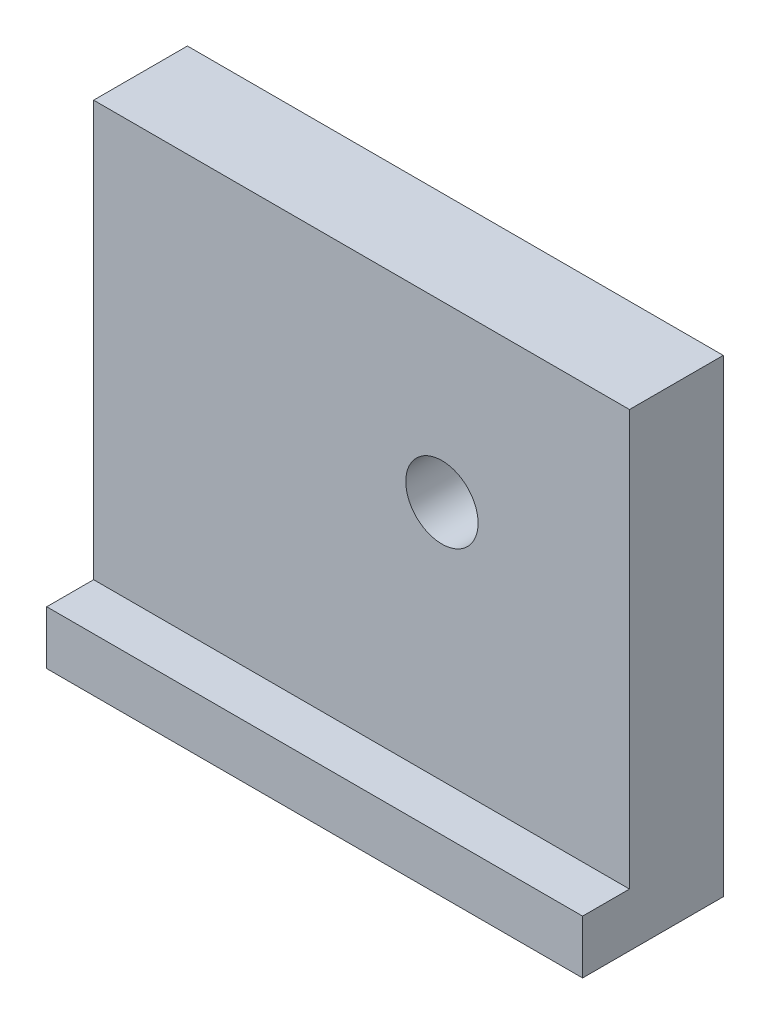
ISO-10303-21;
HEADER;
FILE_DESCRIPTION(('STEP AP214'),'2;1');
FILE_NAME('part.step','',(''),(''),'','','');
FILE_SCHEMA(('AUTOMOTIVE_DESIGN { 1 0 10303 214 1 1 1 1 }'));
ENDSEC;
DATA;
#1=APPLICATION_CONTEXT('core data for automotive mechanical design processes');
#2=APPLICATION_PROTOCOL_DEFINITION('international standard','automotive_design',2000,#1);
#3=PRODUCT_CONTEXT('',#1,'mechanical');
#4=PRODUCT('Part','Part','',(#3));
#5=PRODUCT_RELATED_PRODUCT_CATEGORY('part','',(#4));
#6=PRODUCT_DEFINITION_FORMATION('','',#4);
#7=PRODUCT_DEFINITION_CONTEXT('part definition',#1,'design');
#8=PRODUCT_DEFINITION('design','',#6,#7);
#9=PRODUCT_DEFINITION_SHAPE('','',#8);
#10=(LENGTH_UNIT() NAMED_UNIT(*) SI_UNIT(.MILLI.,.METRE.));
#11=(NAMED_UNIT(*) PLANE_ANGLE_UNIT() SI_UNIT($,.RADIAN.));
#12=(NAMED_UNIT(*) SI_UNIT($,.STERADIAN.) SOLID_ANGLE_UNIT());
#13=UNCERTAINTY_MEASURE_WITH_UNIT(LENGTH_MEASURE(1.E-05),#10,'distance_accuracy_value','');
#14=(GEOMETRIC_REPRESENTATION_CONTEXT(3) GLOBAL_UNCERTAINTY_ASSIGNED_CONTEXT((#13)) GLOBAL_UNIT_ASSIGNED_CONTEXT((#10,
#11,#12)) REPRESENTATION_CONTEXT('',''));
#15=CARTESIAN_POINT('',(0.,0.,0.));
#16=DIRECTION('',(0.,0.,1.));
#17=DIRECTION('',(1.,0.,0.));
#18=AXIS2_PLACEMENT_3D('',#15,#16,#17);
#19=CARTESIAN_POINT('',(0.,0.,3.5));
#20=DIRECTION('',(0.,0.,1.));
#21=DIRECTION('',(1.,0.,0.));
#22=AXIS2_PLACEMENT_3D('',#19,#20,#21);
#23=PLANE('',#22);
#24=CARTESIAN_POINT('',(6.,22.,3.5));
#25=DIRECTION('',(0.,0.,1.));
#26=DIRECTION('',(1.,0.,0.));
#27=AXIS2_PLACEMENT_3D('',#24,#25,#26);
#28=CIRCLE('',#27,2.7);
#29=CARTESIAN_POINT('',(8.7,22.,3.5));
#30=VERTEX_POINT('',#29);
#31=EDGE_CURVE('E111',#30,#30,#28,.T.);
#32=ORIENTED_EDGE('',*,*,#31,.F.);
#33=EDGE_LOOP('',(#32));
#34=FACE_BOUND('',#33,.T.);
#35=DIRECTION('',(0.,-1.,0.));
#36=VECTOR('',#35,1.);
#37=CARTESIAN_POINT('',(-20.,35.,3.5));
#38=LINE('',#37,#36);
#39=CARTESIAN_POINT('',(-20.,35.,3.5));
#40=VERTEX_POINT('',#39);
#41=CARTESIAN_POINT('',(-20.,4.,3.5));
#42=VERTEX_POINT('',#41);
#43=EDGE_CURVE('E96',#40,#42,#38,.T.);
#44=ORIENTED_EDGE('',*,*,#43,.T.);
#45=DIRECTION('',(1.,0.,0.));
#46=VECTOR('',#45,1.);
#47=CARTESIAN_POINT('',(0.,4.,3.5));
#48=LINE('',#47,#46);
#49=CARTESIAN_POINT('',(20.,4.,3.5));
#50=VERTEX_POINT('',#49);
#51=EDGE_CURVE('E132',#42,#50,#48,.T.);
#52=ORIENTED_EDGE('',*,*,#51,.T.);
#53=DIRECTION('',(0.,1.,0.));
#54=VECTOR('',#53,1.);
#55=CARTESIAN_POINT('',(20.,35.,3.5));
#56=LINE('',#55,#54);
#57=CARTESIAN_POINT('',(20.,35.,3.5));
#58=VERTEX_POINT('',#57);
#59=EDGE_CURVE('E105',#50,#58,#56,.T.);
#60=ORIENTED_EDGE('',*,*,#59,.T.);
#61=DIRECTION('',(-1.,0.,0.));
#62=VECTOR('',#61,1.);
#63=CARTESIAN_POINT('',(-20.,35.,3.5));
#64=LINE('',#63,#62);
#65=EDGE_CURVE('E63',#58,#40,#64,.T.);
#66=ORIENTED_EDGE('',*,*,#65,.T.);
#67=EDGE_LOOP('',(#44,#52,#60,#66));
#68=FACE_BOUND('',#67,.T.);
#69=ADVANCED_FACE('F39',(#34,#68),#23,.T.);
#70=CARTESIAN_POINT('',(0.,0.,-3.5));
#71=DIRECTION('',(0.,0.,1.));
#72=DIRECTION('',(1.,0.,0.));
#73=AXIS2_PLACEMENT_3D('',#70,#71,#72);
#74=PLANE('',#73);
#75=DIRECTION('',(0.,1.,0.));
#76=VECTOR('',#75,1.);
#77=CARTESIAN_POINT('',(20.,35.,-3.5));
#78=LINE('',#77,#76);
#79=CARTESIAN_POINT('',(20.,0.,-3.5));
#80=VERTEX_POINT('',#79);
#81=CARTESIAN_POINT('',(20.,35.,-3.5));
#82=VERTEX_POINT('',#81);
#83=EDGE_CURVE('E88',#80,#82,#78,.T.);
#84=ORIENTED_EDGE('',*,*,#83,.F.);
#85=DIRECTION('',(1.,0.,0.));
#86=VECTOR('',#85,1.);
#87=CARTESIAN_POINT('',(-20.,0.,-3.5));
#88=LINE('',#87,#86);
#89=CARTESIAN_POINT('',(-20.,0.,-3.5));
#90=VERTEX_POINT('',#89);
#91=EDGE_CURVE('E99',#90,#80,#88,.T.);
#92=ORIENTED_EDGE('',*,*,#91,.F.);
#93=DIRECTION('',(0.,-1.,0.));
#94=VECTOR('',#93,1.);
#95=CARTESIAN_POINT('',(-20.,35.,-3.5));
#96=LINE('',#95,#94);
#97=CARTESIAN_POINT('',(-20.,35.,-3.5));
#98=VERTEX_POINT('',#97);
#99=EDGE_CURVE('E106',#98,#90,#96,.T.);
#100=ORIENTED_EDGE('',*,*,#99,.F.);
#101=DIRECTION('',(-1.,0.,0.));
#102=VECTOR('',#101,1.);
#103=CARTESIAN_POINT('',(-20.,35.,-3.5));
#104=LINE('',#103,#102);
#105=EDGE_CURVE('E110',#82,#98,#104,.T.);
#106=ORIENTED_EDGE('',*,*,#105,.F.);
#107=EDGE_LOOP('',(#84,#92,#100,#106));
#108=FACE_BOUND('',#107,.T.);
#109=CARTESIAN_POINT('',(6.,22.,-3.5));
#110=DIRECTION('',(0.,0.,1.));
#111=DIRECTION('',(1.,0.,0.));
#112=AXIS2_PLACEMENT_3D('',#109,#110,#111);
#113=CIRCLE('',#112,2.7);
#114=CARTESIAN_POINT('',(8.7,22.,-3.5));
#115=VERTEX_POINT('',#114);
#116=EDGE_CURVE('E115',#115,#115,#113,.T.);
#117=ORIENTED_EDGE('',*,*,#116,.T.);
#118=EDGE_LOOP('',(#117));
#119=FACE_BOUND('',#118,.T.);
#120=ADVANCED_FACE('F108',(#108,#119),#74,.F.);
#121=CARTESIAN_POINT('',(20.,35.,3.5));
#122=DIRECTION('',(-1.,0.,0.));
#123=DIRECTION('',(0.,-1.,0.));
#124=AXIS2_PLACEMENT_3D('',#121,#122,#123);
#125=PLANE('',#124);
#126=ORIENTED_EDGE('',*,*,#59,.F.);
#127=DIRECTION('',(0.,0.,-1.));
#128=VECTOR('',#127,1.);
#129=CARTESIAN_POINT('',(20.,4.,7.));
#130=LINE('',#129,#128);
#131=CARTESIAN_POINT('',(20.,4.,7.));
#132=VERTEX_POINT('',#131);
#133=EDGE_CURVE('E54',#132,#50,#130,.T.);
#134=ORIENTED_EDGE('',*,*,#133,.F.);
#135=DIRECTION('',(0.,1.,0.));
#136=VECTOR('',#135,1.);
#137=CARTESIAN_POINT('',(20.,0.,7.));
#138=LINE('',#137,#136);
#139=CARTESIAN_POINT('',(20.,0.,7.));
#140=VERTEX_POINT('',#139);
#141=EDGE_CURVE('E91',#140,#132,#138,.T.);
#142=ORIENTED_EDGE('',*,*,#141,.F.);
#143=DIRECTION('',(0.,0.,-1.));
#144=VECTOR('',#143,1.);
#145=CARTESIAN_POINT('',(20.,0.,3.5));
#146=LINE('',#145,#144);
#147=EDGE_CURVE('E83',#140,#80,#146,.T.);
#148=ORIENTED_EDGE('',*,*,#147,.T.);
#149=ORIENTED_EDGE('',*,*,#83,.T.);
#150=DIRECTION('',(0.,0.,-1.));
#151=VECTOR('',#150,1.);
#152=CARTESIAN_POINT('',(20.,35.,3.5));
#153=LINE('',#152,#151);
#154=EDGE_CURVE('E11',#58,#82,#153,.T.);
#155=ORIENTED_EDGE('',*,*,#154,.F.);
#156=EDGE_LOOP('',(#126,#134,#142,#148,#149,#155));
#157=FACE_BOUND('',#156,.T.);
#158=ADVANCED_FACE('F41',(#157),#125,.F.);
#159=CARTESIAN_POINT('',(-20.,35.,3.5));
#160=DIRECTION('',(0.,-1.,0.));
#161=DIRECTION('',(0.,0.,-1.));
#162=AXIS2_PLACEMENT_3D('',#159,#160,#161);
#163=PLANE('',#162);
#164=ORIENTED_EDGE('',*,*,#105,.T.);
#165=DIRECTION('',(0.,0.,-1.));
#166=VECTOR('',#165,1.);
#167=CARTESIAN_POINT('',(-20.,35.,3.5));
#168=LINE('',#167,#166);
#169=EDGE_CURVE('E47',#40,#98,#168,.T.);
#170=ORIENTED_EDGE('',*,*,#169,.F.);
#171=ORIENTED_EDGE('',*,*,#65,.F.);
#172=ORIENTED_EDGE('',*,*,#154,.T.);
#173=EDGE_LOOP('',(#164,#170,#171,#172));
#174=FACE_BOUND('',#173,.T.);
#175=ADVANCED_FACE('F127',(#174),#163,.F.);
#176=CARTESIAN_POINT('',(-20.,35.,3.5));
#177=DIRECTION('',(1.,0.,0.));
#178=DIRECTION('',(0.,1.,0.));
#179=AXIS2_PLACEMENT_3D('',#176,#177,#178);
#180=PLANE('',#179);
#181=DIRECTION('',(0.,0.,-1.));
#182=VECTOR('',#181,1.);
#183=CARTESIAN_POINT('',(-20.,0.,3.5));
#184=LINE('',#183,#182);
#185=CARTESIAN_POINT('',(-20.,0.,7.));
#186=VERTEX_POINT('',#185);
#187=EDGE_CURVE('E95',#186,#90,#184,.T.);
#188=ORIENTED_EDGE('',*,*,#187,.F.);
#189=DIRECTION('',(0.,-1.,0.));
#190=VECTOR('',#189,1.);
#191=CARTESIAN_POINT('',(-20.,0.,7.));
#192=LINE('',#191,#190);
#193=CARTESIAN_POINT('',(-20.,4.,7.));
#194=VERTEX_POINT('',#193);
#195=EDGE_CURVE('E144',#194,#186,#192,.T.);
#196=ORIENTED_EDGE('',*,*,#195,.F.);
#197=DIRECTION('',(0.,0.,-1.));
#198=VECTOR('',#197,1.);
#199=CARTESIAN_POINT('',(-20.,4.,7.));
#200=LINE('',#199,#198);
#201=EDGE_CURVE('E136',#194,#42,#200,.T.);
#202=ORIENTED_EDGE('',*,*,#201,.T.);
#203=ORIENTED_EDGE('',*,*,#43,.F.);
#204=ORIENTED_EDGE('',*,*,#169,.T.);
#205=ORIENTED_EDGE('',*,*,#99,.T.);
#206=EDGE_LOOP('',(#188,#196,#202,#203,#204,#205));
#207=FACE_BOUND('',#206,.T.);
#208=ADVANCED_FACE('F124',(#207),#180,.F.);
#209=CARTESIAN_POINT('',(-20.,0.,3.5));
#210=DIRECTION('',(0.,1.,0.));
#211=DIRECTION('',(0.,0.,1.));
#212=AXIS2_PLACEMENT_3D('',#209,#210,#211);
#213=PLANE('',#212);
#214=ORIENTED_EDGE('',*,*,#91,.T.);
#215=ORIENTED_EDGE('',*,*,#147,.F.);
#216=DIRECTION('',(1.,0.,0.));
#217=VECTOR('',#216,1.);
#218=CARTESIAN_POINT('',(-20.,0.,7.));
#219=LINE('',#218,#217);
#220=EDGE_CURVE('E142',#186,#140,#219,.T.);
#221=ORIENTED_EDGE('',*,*,#220,.F.);
#222=ORIENTED_EDGE('',*,*,#187,.T.);
#223=EDGE_LOOP('',(#214,#215,#221,#222));
#224=FACE_BOUND('',#223,.T.);
#225=ADVANCED_FACE('F100',(#224),#213,.F.);
#226=CARTESIAN_POINT('',(6.,22.,3.5));
#227=DIRECTION('',(0.,0.,-1.));
#228=DIRECTION('',(-1.,0.,0.));
#229=AXIS2_PLACEMENT_3D('',#226,#227,#228);
#230=CYLINDRICAL_SURFACE('',#229,2.7);
#231=ORIENTED_EDGE('',*,*,#31,.T.);
#232=EDGE_LOOP('',(#231));
#233=FACE_BOUND('',#232,.T.);
#234=ORIENTED_EDGE('',*,*,#116,.F.);
#235=EDGE_LOOP('',(#234));
#236=FACE_BOUND('',#235,.T.);
#237=ADVANCED_FACE('F168',(#233,#236),#230,.F.);
#238=CARTESIAN_POINT('',(-20.,4.,7.));
#239=DIRECTION('',(0.,-1.,0.));
#240=DIRECTION('',(0.,0.,-1.));
#241=AXIS2_PLACEMENT_3D('',#238,#239,#240);
#242=PLANE('',#241);
#243=ORIENTED_EDGE('',*,*,#51,.F.);
#244=ORIENTED_EDGE('',*,*,#201,.F.);
#245=DIRECTION('',(-1.,0.,0.));
#246=VECTOR('',#245,1.);
#247=CARTESIAN_POINT('',(-20.,4.,7.));
#248=LINE('',#247,#246);
#249=EDGE_CURVE('E138',#132,#194,#248,.T.);
#250=ORIENTED_EDGE('',*,*,#249,.F.);
#251=ORIENTED_EDGE('',*,*,#133,.T.);
#252=EDGE_LOOP('',(#243,#244,#250,#251));
#253=FACE_BOUND('',#252,.T.);
#254=ADVANCED_FACE('F156',(#253),#242,.F.);
#255=CARTESIAN_POINT('',(0.,0.,7.));
#256=DIRECTION('',(0.,0.,-1.));
#257=DIRECTION('',(-1.,0.,0.));
#258=AXIS2_PLACEMENT_3D('',#255,#256,#257);
#259=PLANE('',#258);
#260=ORIENTED_EDGE('',*,*,#195,.T.);
#261=ORIENTED_EDGE('',*,*,#220,.T.);
#262=ORIENTED_EDGE('',*,*,#141,.T.);
#263=ORIENTED_EDGE('',*,*,#249,.T.);
#264=EDGE_LOOP('',(#260,#261,#262,#263));
#265=FACE_BOUND('',#264,.T.);
#266=ADVANCED_FACE('F149',(#265),#259,.F.);
#267=CLOSED_SHELL('',(#69,#120,#158,#175,#208,#225,#237,#254,#266));
#268=MANIFOLD_SOLID_BREP('B2',#267);
#269=ADVANCED_BREP_SHAPE_REPRESENTATION('',(#18,#268),#14);
#270=SHAPE_DEFINITION_REPRESENTATION(#9,#269);
ENDSEC;
END-ISO-10303-21;
